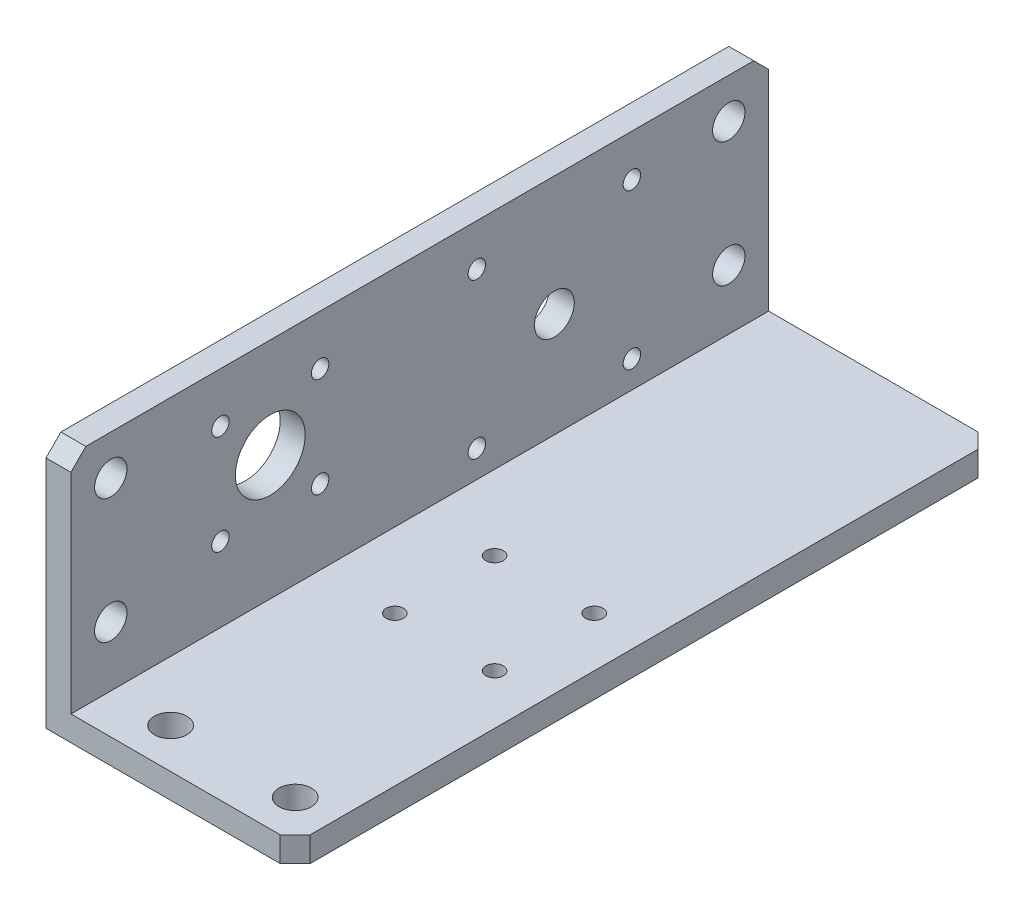
ISO-10303-21;
HEADER;
FILE_DESCRIPTION(('STEP AP214'),'2;1');
FILE_NAME('part.step','',(''),(''),'','','');
FILE_SCHEMA(('AUTOMOTIVE_DESIGN { 1 0 10303 214 1 1 1 1 }'));
ENDSEC;
DATA;
#1=APPLICATION_CONTEXT('core data for automotive mechanical design processes');
#2=APPLICATION_PROTOCOL_DEFINITION('international standard','automotive_design',2000,#1);
#3=PRODUCT_CONTEXT('',#1,'mechanical');
#4=PRODUCT('Part','Part','',(#3));
#5=PRODUCT_RELATED_PRODUCT_CATEGORY('part','',(#4));
#6=PRODUCT_DEFINITION_FORMATION('','',#4);
#7=PRODUCT_DEFINITION_CONTEXT('part definition',#1,'design');
#8=PRODUCT_DEFINITION('design','',#6,#7);
#9=PRODUCT_DEFINITION_SHAPE('','',#8);
#10=(LENGTH_UNIT() NAMED_UNIT(*) SI_UNIT(.MILLI.,.METRE.));
#11=(NAMED_UNIT(*) PLANE_ANGLE_UNIT() SI_UNIT($,.RADIAN.));
#12=(NAMED_UNIT(*) SI_UNIT($,.STERADIAN.) SOLID_ANGLE_UNIT());
#13=UNCERTAINTY_MEASURE_WITH_UNIT(LENGTH_MEASURE(1.E-05),#10,'distance_accuracy_value','');
#14=(GEOMETRIC_REPRESENTATION_CONTEXT(3) GLOBAL_UNCERTAINTY_ASSIGNED_CONTEXT((#13)) GLOBAL_UNIT_ASSIGNED_CONTEXT((#10,
#11,#12)) REPRESENTATION_CONTEXT('',''));
#15=CARTESIAN_POINT('',(0.,0.,0.));
#16=DIRECTION('',(0.,0.,1.));
#17=DIRECTION('',(1.,0.,0.));
#18=AXIS2_PLACEMENT_3D('',#15,#16,#17);
#19=CARTESIAN_POINT('',(50.,0.,140.));
#20=DIRECTION('',(0.,1.,0.));
#21=DIRECTION('',(-1.,0.,0.));
#22=AXIS2_PLACEMENT_3D('',#19,#20,#21);
#23=PLANE('',#22);
#24=CARTESIAN_POINT('',(40.,0.,70.));
#25=DIRECTION('',(0.,-1.,0.));
#26=DIRECTION('',(1.,0.,0.));
#27=AXIS2_PLACEMENT_3D('',#24,#25,#26);
#28=CIRCLE('',#27,1.75000000000001);
#29=CARTESIAN_POINT('',(41.75,0.,70.));
#30=VERTEX_POINT('',#29);
#31=EDGE_CURVE('E276',#30,#30,#28,.T.);
#32=ORIENTED_EDGE('',*,*,#31,.F.);
#33=EDGE_LOOP('',(#32));
#34=FACE_BOUND('',#33,.T.);
#35=CARTESIAN_POINT('',(40.,0.,90.));
#36=DIRECTION('',(0.,-1.,0.));
#37=DIRECTION('',(1.,0.,0.));
#38=AXIS2_PLACEMENT_3D('',#35,#36,#37);
#39=CIRCLE('',#38,1.75000000000001);
#40=CARTESIAN_POINT('',(41.75,0.,90.));
#41=VERTEX_POINT('',#40);
#42=EDGE_CURVE('E270',#41,#41,#39,.T.);
#43=ORIENTED_EDGE('',*,*,#42,.F.);
#44=EDGE_LOOP('',(#43));
#45=FACE_BOUND('',#44,.T.);
#46=CARTESIAN_POINT('',(20.,0.,90.));
#47=DIRECTION('',(0.,-1.,0.));
#48=DIRECTION('',(1.,0.,0.));
#49=AXIS2_PLACEMENT_3D('',#46,#47,#48);
#50=CIRCLE('',#49,1.75000000000001);
#51=CARTESIAN_POINT('',(21.75,0.,90.));
#52=VERTEX_POINT('',#51);
#53=EDGE_CURVE('E264',#52,#52,#50,.T.);
#54=ORIENTED_EDGE('',*,*,#53,.F.);
#55=EDGE_LOOP('',(#54));
#56=FACE_BOUND('',#55,.T.);
#57=CARTESIAN_POINT('',(20.,0.,70.));
#58=DIRECTION('',(0.,-1.,0.));
#59=DIRECTION('',(1.,0.,0.));
#60=AXIS2_PLACEMENT_3D('',#57,#58,#59);
#61=CIRCLE('',#60,1.75);
#62=CARTESIAN_POINT('',(21.75,0.,70.));
#63=VERTEX_POINT('',#62);
#64=EDGE_CURVE('E258',#63,#63,#61,.T.);
#65=ORIENTED_EDGE('',*,*,#64,.F.);
#66=EDGE_LOOP('',(#65));
#67=FACE_BOUND('',#66,.T.);
#68=CARTESIAN_POINT('',(17.,0.,132.));
#69=DIRECTION('',(0.,-1.,0.));
#70=DIRECTION('',(0.,0.,-1.));
#71=AXIS2_PLACEMENT_3D('',#68,#69,#70);
#72=CIRCLE('',#71,3.24999999999999);
#73=CARTESIAN_POINT('',(17.,0.,128.75));
#74=VERTEX_POINT('',#73);
#75=EDGE_CURVE('E228',#74,#74,#72,.T.);
#76=ORIENTED_EDGE('',*,*,#75,.F.);
#77=EDGE_LOOP('',(#76));
#78=FACE_BOUND('',#77,.T.);
#79=CARTESIAN_POINT('',(42.,0.,132.));
#80=DIRECTION('',(0.,-1.,0.));
#81=DIRECTION('',(0.,0.,-1.));
#82=AXIS2_PLACEMENT_3D('',#79,#80,#81);
#83=CIRCLE('',#82,3.24999999999999);
#84=CARTESIAN_POINT('',(42.,0.,128.75));
#85=VERTEX_POINT('',#84);
#86=EDGE_CURVE('E222',#85,#85,#83,.T.);
#87=ORIENTED_EDGE('',*,*,#86,.F.);
#88=EDGE_LOOP('',(#87));
#89=FACE_BOUND('',#88,.T.);
#90=DIRECTION('',(1.,0.,0.));
#91=VECTOR('',#90,1.);
#92=CARTESIAN_POINT('',(50.,0.,0.));
#93=LINE('',#92,#91);
#94=CARTESIAN_POINT('',(0.,0.,0.));
#95=VERTEX_POINT('',#94);
#96=CARTESIAN_POINT('',(47.,0.,0.));
#97=VERTEX_POINT('',#96);
#98=EDGE_CURVE('E142',#95,#97,#93,.T.);
#99=ORIENTED_EDGE('',*,*,#98,.T.);
#100=DIRECTION('',(0.707106781186552,0.,0.707106781186543));
#101=VECTOR('',#100,1.);
#102=CARTESIAN_POINT('',(50.,0.,3.));
#103=LINE('',#102,#101);
#104=CARTESIAN_POINT('',(50.,0.,3.00000000000004));
#105=VERTEX_POINT('',#104);
#106=EDGE_CURVE('E177',#97,#105,#103,.T.);
#107=ORIENTED_EDGE('',*,*,#106,.T.);
#108=DIRECTION('',(0.,0.,-1.));
#109=VECTOR('',#108,1.);
#110=CARTESIAN_POINT('',(50.,0.,140.));
#111=LINE('',#110,#109);
#112=CARTESIAN_POINT('',(50.,0.,137.));
#113=VERTEX_POINT('',#112);
#114=EDGE_CURVE('E159',#113,#105,#111,.T.);
#115=ORIENTED_EDGE('',*,*,#114,.F.);
#116=DIRECTION('',(0.707106781186548,0.,-0.707106781186548));
#117=VECTOR('',#116,1.);
#118=CARTESIAN_POINT('',(47.,0.,140.));
#119=LINE('',#118,#117);
#120=CARTESIAN_POINT('',(47.,0.,140.));
#121=VERTEX_POINT('',#120);
#122=EDGE_CURVE('E175',#113,#121,#119,.F.);
#123=ORIENTED_EDGE('',*,*,#122,.T.);
#124=DIRECTION('',(1.,0.,0.));
#125=VECTOR('',#124,1.);
#126=CARTESIAN_POINT('',(50.,0.,140.));
#127=LINE('',#126,#125);
#128=CARTESIAN_POINT('',(0.,0.,140.));
#129=VERTEX_POINT('',#128);
#130=EDGE_CURVE('E122',#129,#121,#127,.T.);
#131=ORIENTED_EDGE('',*,*,#130,.F.);
#132=DIRECTION('',(0.,0.,-1.));
#133=VECTOR('',#132,1.);
#134=CARTESIAN_POINT('',(0.,0.,140.));
#135=LINE('',#134,#133);
#136=EDGE_CURVE('E138',#129,#95,#135,.T.);
#137=ORIENTED_EDGE('',*,*,#136,.T.);
#138=EDGE_LOOP('',(#99,#107,#115,#123,#131,#137));
#139=FACE_BOUND('',#138,.T.);
#140=ADVANCED_FACE('F36',(#34,#45,#56,#67,#78,#89,#139),#23,.F.);
#141=CARTESIAN_POINT('',(50.,5.,140.));
#142=DIRECTION('',(-1.,0.,0.));
#143=DIRECTION('',(0.,0.,1.));
#144=AXIS2_PLACEMENT_3D('',#141,#142,#143);
#145=PLANE('',#144);
#146=ORIENTED_EDGE('',*,*,#114,.T.);
#147=DIRECTION('',(0.,1.,0.));
#148=VECTOR('',#147,1.);
#149=CARTESIAN_POINT('',(50.,5.,3.));
#150=LINE('',#149,#148);
#151=CARTESIAN_POINT('',(50.,5.,3.00000000000004));
#152=VERTEX_POINT('',#151);
#153=EDGE_CURVE('E164',#105,#152,#150,.T.);
#154=ORIENTED_EDGE('',*,*,#153,.T.);
#155=DIRECTION('',(0.,0.,-1.));
#156=VECTOR('',#155,1.);
#157=CARTESIAN_POINT('',(50.,5.,140.));
#158=LINE('',#157,#156);
#159=CARTESIAN_POINT('',(50.,5.,137.));
#160=VERTEX_POINT('',#159);
#161=EDGE_CURVE('E132',#160,#152,#158,.T.);
#162=ORIENTED_EDGE('',*,*,#161,.F.);
#163=DIRECTION('',(0.,-1.,0.));
#164=VECTOR('',#163,1.);
#165=CARTESIAN_POINT('',(50.,5.,137.));
#166=LINE('',#165,#164);
#167=EDGE_CURVE('E162',#160,#113,#166,.T.);
#168=ORIENTED_EDGE('',*,*,#167,.T.);
#169=EDGE_LOOP('',(#146,#154,#162,#168));
#170=FACE_BOUND('',#169,.T.);
#171=ADVANCED_FACE('F214',(#170),#145,.F.);
#172=CARTESIAN_POINT('',(5.00000000000001,5.,140.));
#173=DIRECTION('',(0.,-1.,0.));
#174=DIRECTION('',(1.,0.,0.));
#175=AXIS2_PLACEMENT_3D('',#172,#173,#174);
#176=PLANE('',#175);
#177=CARTESIAN_POINT('',(40.,5.,70.));
#178=DIRECTION('',(0.,-1.,0.));
#179=DIRECTION('',(1.,0.,0.));
#180=AXIS2_PLACEMENT_3D('',#177,#178,#179);
#181=CIRCLE('',#180,1.75000000000001);
#182=CARTESIAN_POINT('',(41.75,5.,70.));
#183=VERTEX_POINT('',#182);
#184=EDGE_CURVE('E273',#183,#183,#181,.F.);
#185=ORIENTED_EDGE('',*,*,#184,.F.);
#186=EDGE_LOOP('',(#185));
#187=FACE_BOUND('',#186,.T.);
#188=CARTESIAN_POINT('',(40.,5.,90.));
#189=DIRECTION('',(0.,-1.,0.));
#190=DIRECTION('',(1.,0.,0.));
#191=AXIS2_PLACEMENT_3D('',#188,#189,#190);
#192=CIRCLE('',#191,1.75000000000001);
#193=CARTESIAN_POINT('',(41.75,5.,90.));
#194=VERTEX_POINT('',#193);
#195=EDGE_CURVE('E267',#194,#194,#192,.F.);
#196=ORIENTED_EDGE('',*,*,#195,.F.);
#197=EDGE_LOOP('',(#196));
#198=FACE_BOUND('',#197,.T.);
#199=CARTESIAN_POINT('',(20.,5.,90.));
#200=DIRECTION('',(0.,-1.,0.));
#201=DIRECTION('',(1.,0.,0.));
#202=AXIS2_PLACEMENT_3D('',#199,#200,#201);
#203=CIRCLE('',#202,1.75000000000001);
#204=CARTESIAN_POINT('',(21.75,5.,90.));
#205=VERTEX_POINT('',#204);
#206=EDGE_CURVE('E261',#205,#205,#203,.F.);
#207=ORIENTED_EDGE('',*,*,#206,.F.);
#208=EDGE_LOOP('',(#207));
#209=FACE_BOUND('',#208,.T.);
#210=CARTESIAN_POINT('',(20.,5.,70.));
#211=DIRECTION('',(0.,-1.,0.));
#212=DIRECTION('',(1.,0.,0.));
#213=AXIS2_PLACEMENT_3D('',#210,#211,#212);
#214=CIRCLE('',#213,1.75);
#215=CARTESIAN_POINT('',(21.75,5.,70.));
#216=VERTEX_POINT('',#215);
#217=EDGE_CURVE('E255',#216,#216,#214,.F.);
#218=ORIENTED_EDGE('',*,*,#217,.F.);
#219=EDGE_LOOP('',(#218));
#220=FACE_BOUND('',#219,.T.);
#221=CARTESIAN_POINT('',(17.,5.,132.));
#222=DIRECTION('',(0.,-1.,0.));
#223=DIRECTION('',(1.,0.,0.));
#224=AXIS2_PLACEMENT_3D('',#221,#222,#223);
#225=CIRCLE('',#224,3.24999999999999);
#226=CARTESIAN_POINT('',(20.25,5.,132.));
#227=VERTEX_POINT('',#226);
#228=EDGE_CURVE('E225',#227,#227,#225,.T.);
#229=ORIENTED_EDGE('',*,*,#228,.T.);
#230=EDGE_LOOP('',(#229));
#231=FACE_BOUND('',#230,.T.);
#232=CARTESIAN_POINT('',(42.,5.,132.));
#233=DIRECTION('',(0.,-1.,0.));
#234=DIRECTION('',(1.,0.,0.));
#235=AXIS2_PLACEMENT_3D('',#232,#233,#234);
#236=CIRCLE('',#235,3.24999999999999);
#237=CARTESIAN_POINT('',(45.25,5.,132.));
#238=VERTEX_POINT('',#237);
#239=EDGE_CURVE('E145',#238,#238,#236,.T.);
#240=ORIENTED_EDGE('',*,*,#239,.T.);
#241=EDGE_LOOP('',(#240));
#242=FACE_BOUND('',#241,.T.);
#243=ORIENTED_EDGE('',*,*,#161,.T.);
#244=DIRECTION('',(-0.707106781186552,0.,-0.707106781186543));
#245=VECTOR('',#244,1.);
#246=CARTESIAN_POINT('',(50.,5.,3.));
#247=LINE('',#246,#245);
#248=CARTESIAN_POINT('',(46.9999999999999,5.,0.));
#249=VERTEX_POINT('',#248);
#250=EDGE_CURVE('E169',#152,#249,#247,.T.);
#251=ORIENTED_EDGE('',*,*,#250,.T.);
#252=DIRECTION('',(-1.,0.,0.));
#253=VECTOR('',#252,1.);
#254=CARTESIAN_POINT('',(5.00000000000001,5.,0.));
#255=LINE('',#254,#253);
#256=CARTESIAN_POINT('',(5.00000000000001,5.,0.));
#257=VERTEX_POINT('',#256);
#258=EDGE_CURVE('E129',#249,#257,#255,.T.);
#259=ORIENTED_EDGE('',*,*,#258,.T.);
#260=DIRECTION('',(0.,0.,-1.));
#261=VECTOR('',#260,1.);
#262=CARTESIAN_POINT('',(5.00000000000001,5.,140.));
#263=LINE('',#262,#261);
#264=CARTESIAN_POINT('',(5.00000000000001,5.,140.));
#265=VERTEX_POINT('',#264);
#266=EDGE_CURVE('E125',#265,#257,#263,.T.);
#267=ORIENTED_EDGE('',*,*,#266,.F.);
#268=DIRECTION('',(-1.,0.,0.));
#269=VECTOR('',#268,1.);
#270=CARTESIAN_POINT('',(5.00000000000001,5.,140.));
#271=LINE('',#270,#269);
#272=CARTESIAN_POINT('',(47.,5.,140.));
#273=VERTEX_POINT('',#272);
#274=EDGE_CURVE('E115',#273,#265,#271,.T.);
#275=ORIENTED_EDGE('',*,*,#274,.F.);
#276=DIRECTION('',(-0.707106781186548,0.,0.707106781186548));
#277=VECTOR('',#276,1.);
#278=CARTESIAN_POINT('',(47.,5.,140.));
#279=LINE('',#278,#277);
#280=EDGE_CURVE('E167',#273,#160,#279,.F.);
#281=ORIENTED_EDGE('',*,*,#280,.T.);
#282=EDGE_LOOP('',(#243,#251,#259,#267,#275,#281));
#283=FACE_BOUND('',#282,.T.);
#284=ADVANCED_FACE('F127',(#187,#198,#209,#220,#231,#242,#283),#176,.F.);
#285=CARTESIAN_POINT('',(5.,50.,140.));
#286=DIRECTION('',(-1.,0.,0.));
#287=DIRECTION('',(0.,-1.,0.));
#288=AXIS2_PLACEMENT_3D('',#285,#286,#287);
#289=PLANE('',#288);
#290=CARTESIAN_POINT('',(5.,41.556349186104,27.4436508138959));
#291=DIRECTION('',(-1.,0.,0.));
#292=DIRECTION('',(0.,-1.,0.));
#293=AXIS2_PLACEMENT_3D('',#290,#291,#292);
#294=CIRCLE('',#293,1.75000000000001);
#295=CARTESIAN_POINT('',(5.,39.806349186104,27.4436508138959));
#296=VERTEX_POINT('',#295);
#297=EDGE_CURVE('E333',#296,#296,#294,.F.);
#298=ORIENTED_EDGE('',*,*,#297,.F.);
#299=EDGE_LOOP('',(#298));
#300=FACE_BOUND('',#299,.T.);
#301=CARTESIAN_POINT('',(5.,10.4436508138959,27.443650813896));
#302=DIRECTION('',(-1.,0.,0.));
#303=DIRECTION('',(0.,-1.,0.));
#304=AXIS2_PLACEMENT_3D('',#301,#302,#303);
#305=CIRCLE('',#304,1.75);
#306=CARTESIAN_POINT('',(5.,8.69365081389594,27.443650813896));
#307=VERTEX_POINT('',#306);
#308=EDGE_CURVE('E327',#307,#307,#305,.F.);
#309=ORIENTED_EDGE('',*,*,#308,.F.);
#310=EDGE_LOOP('',(#309));
#311=FACE_BOUND('',#310,.T.);
#312=CARTESIAN_POINT('',(5.,10.443650813896,58.5563491861041));
#313=DIRECTION('',(-1.,0.,0.));
#314=DIRECTION('',(0.,-1.,0.));
#315=AXIS2_PLACEMENT_3D('',#312,#313,#314);
#316=CIRCLE('',#315,1.75000000000001);
#317=CARTESIAN_POINT('',(5.,8.69365081389597,58.5563491861041));
#318=VERTEX_POINT('',#317);
#319=EDGE_CURVE('E321',#318,#318,#316,.F.);
#320=ORIENTED_EDGE('',*,*,#319,.F.);
#321=EDGE_LOOP('',(#320));
#322=FACE_BOUND('',#321,.T.);
#323=CARTESIAN_POINT('',(5.,41.5563491861041,58.556349186104));
#324=DIRECTION('',(-1.,0.,0.));
#325=DIRECTION('',(0.,-1.,0.));
#326=AXIS2_PLACEMENT_3D('',#323,#324,#325);
#327=CIRCLE('',#326,1.75);
#328=CARTESIAN_POINT('',(5.,39.8063491861041,58.556349186104));
#329=VERTEX_POINT('',#328);
#330=EDGE_CURVE('E315',#329,#329,#327,.F.);
#331=ORIENTED_EDGE('',*,*,#330,.F.);
#332=EDGE_LOOP('',(#331));
#333=FACE_BOUND('',#332,.T.);
#334=CARTESIAN_POINT('',(5.,26.,43.));
#335=DIRECTION('',(-1.,0.,0.));
#336=DIRECTION('',(0.,-1.,0.));
#337=AXIS2_PLACEMENT_3D('',#334,#335,#336);
#338=CIRCLE('',#337,4.00000000000001);
#339=CARTESIAN_POINT('',(5.00000000000001,22.,43.));
#340=VERTEX_POINT('',#339);
#341=EDGE_CURVE('E309',#340,#340,#338,.F.);
#342=ORIENTED_EDGE('',*,*,#341,.F.);
#343=EDGE_LOOP('',(#342));
#344=FACE_BOUND('',#343,.T.);
#345=CARTESIAN_POINT('',(5.,20.,90.));
#346=DIRECTION('',(-1.,0.,0.));
#347=DIRECTION('',(0.,-1.,0.));
#348=AXIS2_PLACEMENT_3D('',#345,#346,#347);
#349=CIRCLE('',#348,1.75000000000001);
#350=CARTESIAN_POINT('',(5.,18.25,90.));
#351=VERTEX_POINT('',#350);
#352=EDGE_CURVE('E303',#351,#351,#349,.F.);
#353=ORIENTED_EDGE('',*,*,#352,.F.);
#354=EDGE_LOOP('',(#353));
#355=FACE_BOUND('',#354,.T.);
#356=CARTESIAN_POINT('',(5.,20.,110.));
#357=DIRECTION('',(-1.,0.,0.));
#358=DIRECTION('',(0.,-1.,0.));
#359=AXIS2_PLACEMENT_3D('',#356,#357,#358);
#360=CIRCLE('',#359,1.75);
#361=CARTESIAN_POINT('',(5.,18.25,110.));
#362=VERTEX_POINT('',#361);
#363=EDGE_CURVE('E297',#362,#362,#360,.F.);
#364=ORIENTED_EDGE('',*,*,#363,.F.);
#365=EDGE_LOOP('',(#364));
#366=FACE_BOUND('',#365,.T.);
#367=CARTESIAN_POINT('',(5.,40.,110.));
#368=DIRECTION('',(-1.,0.,0.));
#369=DIRECTION('',(0.,-1.,0.));
#370=AXIS2_PLACEMENT_3D('',#367,#368,#369);
#371=CIRCLE('',#370,1.75000000000001);
#372=CARTESIAN_POINT('',(5.,38.25,110.));
#373=VERTEX_POINT('',#372);
#374=EDGE_CURVE('E291',#373,#373,#371,.F.);
#375=ORIENTED_EDGE('',*,*,#374,.F.);
#376=EDGE_LOOP('',(#375));
#377=FACE_BOUND('',#376,.T.);
#378=CARTESIAN_POINT('',(5.,30.,100.));
#379=DIRECTION('',(-1.,0.,0.));
#380=DIRECTION('',(0.,-1.,0.));
#381=AXIS2_PLACEMENT_3D('',#378,#379,#380);
#382=CIRCLE('',#381,7.);
#383=CARTESIAN_POINT('',(5.00000000000001,23.,100.));
#384=VERTEX_POINT('',#383);
#385=EDGE_CURVE('E285',#384,#384,#382,.F.);
#386=ORIENTED_EDGE('',*,*,#385,.F.);
#387=EDGE_LOOP('',(#386));
#388=FACE_BOUND('',#387,.T.);
#389=CARTESIAN_POINT('',(5.,40.,90.));
#390=DIRECTION('',(-1.,0.,0.));
#391=DIRECTION('',(0.,-1.,0.));
#392=AXIS2_PLACEMENT_3D('',#389,#390,#391);
#393=CIRCLE('',#392,1.75);
#394=CARTESIAN_POINT('',(5.,38.25,90.));
#395=VERTEX_POINT('',#394);
#396=EDGE_CURVE('E279',#395,#395,#393,.F.);
#397=ORIENTED_EDGE('',*,*,#396,.F.);
#398=EDGE_LOOP('',(#397));
#399=FACE_BOUND('',#398,.T.);
#400=CARTESIAN_POINT('',(5.,42.,8.00000000000001));
#401=DIRECTION('',(-1.,0.,0.));
#402=DIRECTION('',(0.,0.,1.));
#403=AXIS2_PLACEMENT_3D('',#400,#401,#402);
#404=CIRCLE('',#403,3.25);
#405=CARTESIAN_POINT('',(5.,42.,11.25));
#406=VERTEX_POINT('',#405);
#407=EDGE_CURVE('E249',#406,#406,#404,.T.);
#408=ORIENTED_EDGE('',*,*,#407,.T.);
#409=EDGE_LOOP('',(#408));
#410=FACE_BOUND('',#409,.T.);
#411=CARTESIAN_POINT('',(5.,17.,8.00000000000001));
#412=DIRECTION('',(-1.,0.,0.));
#413=DIRECTION('',(0.,0.,1.));
#414=AXIS2_PLACEMENT_3D('',#411,#412,#413);
#415=CIRCLE('',#414,3.25);
#416=CARTESIAN_POINT('',(5.,17.,11.25));
#417=VERTEX_POINT('',#416);
#418=EDGE_CURVE('E243',#417,#417,#415,.T.);
#419=ORIENTED_EDGE('',*,*,#418,.T.);
#420=EDGE_LOOP('',(#419));
#421=FACE_BOUND('',#420,.T.);
#422=CARTESIAN_POINT('',(5.,42.,132.));
#423=DIRECTION('',(-1.,0.,0.));
#424=DIRECTION('',(0.,0.,1.));
#425=AXIS2_PLACEMENT_3D('',#422,#423,#424);
#426=CIRCLE('',#425,3.25);
#427=CARTESIAN_POINT('',(5.,42.,135.25));
#428=VERTEX_POINT('',#427);
#429=EDGE_CURVE('E237',#428,#428,#426,.T.);
#430=ORIENTED_EDGE('',*,*,#429,.T.);
#431=EDGE_LOOP('',(#430));
#432=FACE_BOUND('',#431,.T.);
#433=CARTESIAN_POINT('',(5.,17.,132.));
#434=DIRECTION('',(-1.,0.,0.));
#435=DIRECTION('',(0.,0.,1.));
#436=AXIS2_PLACEMENT_3D('',#433,#434,#435);
#437=CIRCLE('',#436,3.25);
#438=CARTESIAN_POINT('',(5.,17.,135.25));
#439=VERTEX_POINT('',#438);
#440=EDGE_CURVE('E231',#439,#439,#437,.T.);
#441=ORIENTED_EDGE('',*,*,#440,.T.);
#442=EDGE_LOOP('',(#441));
#443=FACE_BOUND('',#442,.T.);
#444=DIRECTION('',(0.,1.,0.));
#445=VECTOR('',#444,1.);
#446=CARTESIAN_POINT('',(5.,50.,0.));
#447=LINE('',#446,#445);
#448=CARTESIAN_POINT('',(5.,47.,0.));
#449=VERTEX_POINT('',#448);
#450=EDGE_CURVE('E147',#257,#449,#447,.T.);
#451=ORIENTED_EDGE('',*,*,#450,.T.);
#452=DIRECTION('',(0.,0.707106781186552,0.707106781186543));
#453=VECTOR('',#452,1.);
#454=CARTESIAN_POINT('',(5.,50.,3.));
#455=LINE('',#454,#453);
#456=CARTESIAN_POINT('',(5.,50.,3.00000000000004));
#457=VERTEX_POINT('',#456);
#458=EDGE_CURVE('E188',#449,#457,#455,.T.);
#459=ORIENTED_EDGE('',*,*,#458,.T.);
#460=DIRECTION('',(0.,0.,-1.));
#461=VECTOR('',#460,1.);
#462=CARTESIAN_POINT('',(5.,50.,140.));
#463=LINE('',#462,#461);
#464=CARTESIAN_POINT('',(5.,50.,137.));
#465=VERTEX_POINT('',#464);
#466=EDGE_CURVE('E133',#465,#457,#463,.T.);
#467=ORIENTED_EDGE('',*,*,#466,.F.);
#468=DIRECTION('',(0.,0.707106781186548,-0.707106781186548));
#469=VECTOR('',#468,1.);
#470=CARTESIAN_POINT('',(5.,47.,140.));
#471=LINE('',#470,#469);
#472=CARTESIAN_POINT('',(5.,47.,140.));
#473=VERTEX_POINT('',#472);
#474=EDGE_CURVE('E51',#465,#473,#471,.F.);
#475=ORIENTED_EDGE('',*,*,#474,.T.);
#476=DIRECTION('',(0.,1.,0.));
#477=VECTOR('',#476,1.);
#478=CARTESIAN_POINT('',(5.,50.,140.));
#479=LINE('',#478,#477);
#480=EDGE_CURVE('E118',#265,#473,#479,.T.);
#481=ORIENTED_EDGE('',*,*,#480,.F.);
#482=ORIENTED_EDGE('',*,*,#266,.T.);
#483=EDGE_LOOP('',(#451,#459,#467,#475,#481,#482));
#484=FACE_BOUND('',#483,.T.);
#485=ADVANCED_FACE('F135',(#300,#311,#322,#333,#344,#355,#366,#377,#388,#399,#410,#421,#432,
#443,#484),#289,.F.);
#486=CARTESIAN_POINT('',(0.,50.,140.));
#487=DIRECTION('',(0.,-1.,0.));
#488=DIRECTION('',(0.,0.,-1.));
#489=AXIS2_PLACEMENT_3D('',#486,#487,#488);
#490=PLANE('',#489);
#491=ORIENTED_EDGE('',*,*,#466,.T.);
#492=DIRECTION('',(-1.,0.,0.));
#493=VECTOR('',#492,1.);
#494=CARTESIAN_POINT('',(0.,50.,3.));
#495=LINE('',#494,#493);
#496=CARTESIAN_POINT('',(0.,50.,3.00000000000004));
#497=VERTEX_POINT('',#496);
#498=EDGE_CURVE('E181',#457,#497,#495,.T.);
#499=ORIENTED_EDGE('',*,*,#498,.T.);
#500=DIRECTION('',(0.,0.,-1.));
#501=VECTOR('',#500,1.);
#502=CARTESIAN_POINT('',(0.,50.,140.));
#503=LINE('',#502,#501);
#504=CARTESIAN_POINT('',(0.,50.,137.));
#505=VERTEX_POINT('',#504);
#506=EDGE_CURVE('E153',#505,#497,#503,.T.);
#507=ORIENTED_EDGE('',*,*,#506,.F.);
#508=DIRECTION('',(1.,0.,0.));
#509=VECTOR('',#508,1.);
#510=CARTESIAN_POINT('',(0.,50.,137.));
#511=LINE('',#510,#509);
#512=EDGE_CURVE('E179',#505,#465,#511,.T.);
#513=ORIENTED_EDGE('',*,*,#512,.T.);
#514=EDGE_LOOP('',(#491,#499,#507,#513));
#515=FACE_BOUND('',#514,.T.);
#516=ADVANCED_FACE('F194',(#515),#490,.F.);
#517=CARTESIAN_POINT('',(0.,0.,140.));
#518=DIRECTION('',(1.,0.,0.));
#519=DIRECTION('',(0.,0.,-1.));
#520=AXIS2_PLACEMENT_3D('',#517,#518,#519);
#521=PLANE('',#520);
#522=CARTESIAN_POINT('',(0.,41.556349186104,27.4436508138959));
#523=DIRECTION('',(-1.,0.,0.));
#524=DIRECTION('',(0.,0.,1.));
#525=AXIS2_PLACEMENT_3D('',#522,#523,#524);
#526=CIRCLE('',#525,1.75000000000001);
#527=CARTESIAN_POINT('',(0.,41.556349186104,29.1936508138959));
#528=VERTEX_POINT('',#527);
#529=EDGE_CURVE('E336',#528,#528,#526,.T.);
#530=ORIENTED_EDGE('',*,*,#529,.F.);
#531=EDGE_LOOP('',(#530));
#532=FACE_BOUND('',#531,.T.);
#533=CARTESIAN_POINT('',(0.,10.4436508138959,27.443650813896));
#534=DIRECTION('',(-1.,0.,0.));
#535=DIRECTION('',(0.,0.,1.));
#536=AXIS2_PLACEMENT_3D('',#533,#534,#535);
#537=CIRCLE('',#536,1.75);
#538=CARTESIAN_POINT('',(0.,10.4436508138959,29.193650813896));
#539=VERTEX_POINT('',#538);
#540=EDGE_CURVE('E330',#539,#539,#537,.T.);
#541=ORIENTED_EDGE('',*,*,#540,.F.);
#542=EDGE_LOOP('',(#541));
#543=FACE_BOUND('',#542,.T.);
#544=CARTESIAN_POINT('',(0.,10.443650813896,58.5563491861041));
#545=DIRECTION('',(-1.,0.,0.));
#546=DIRECTION('',(0.,0.,1.));
#547=AXIS2_PLACEMENT_3D('',#544,#545,#546);
#548=CIRCLE('',#547,1.75000000000001);
#549=CARTESIAN_POINT('',(0.,10.443650813896,60.3063491861041));
#550=VERTEX_POINT('',#549);
#551=EDGE_CURVE('E324',#550,#550,#548,.T.);
#552=ORIENTED_EDGE('',*,*,#551,.F.);
#553=EDGE_LOOP('',(#552));
#554=FACE_BOUND('',#553,.T.);
#555=CARTESIAN_POINT('',(0.,41.5563491861041,58.556349186104));
#556=DIRECTION('',(-1.,0.,0.));
#557=DIRECTION('',(0.,0.,1.));
#558=AXIS2_PLACEMENT_3D('',#555,#556,#557);
#559=CIRCLE('',#558,1.75);
#560=CARTESIAN_POINT('',(0.,41.5563491861041,60.306349186104));
#561=VERTEX_POINT('',#560);
#562=EDGE_CURVE('E318',#561,#561,#559,.T.);
#563=ORIENTED_EDGE('',*,*,#562,.F.);
#564=EDGE_LOOP('',(#563));
#565=FACE_BOUND('',#564,.T.);
#566=CARTESIAN_POINT('',(0.,26.,43.));
#567=DIRECTION('',(-1.,0.,0.));
#568=DIRECTION('',(0.,0.,1.));
#569=AXIS2_PLACEMENT_3D('',#566,#567,#568);
#570=CIRCLE('',#569,4.00000000000001);
#571=CARTESIAN_POINT('',(0.,26.,47.));
#572=VERTEX_POINT('',#571);
#573=EDGE_CURVE('E312',#572,#572,#570,.T.);
#574=ORIENTED_EDGE('',*,*,#573,.F.);
#575=EDGE_LOOP('',(#574));
#576=FACE_BOUND('',#575,.T.);
#577=CARTESIAN_POINT('',(0.,20.,90.));
#578=DIRECTION('',(-1.,0.,0.));
#579=DIRECTION('',(0.,0.,1.));
#580=AXIS2_PLACEMENT_3D('',#577,#578,#579);
#581=CIRCLE('',#580,1.75000000000001);
#582=CARTESIAN_POINT('',(0.,20.,91.75));
#583=VERTEX_POINT('',#582);
#584=EDGE_CURVE('E306',#583,#583,#581,.T.);
#585=ORIENTED_EDGE('',*,*,#584,.F.);
#586=EDGE_LOOP('',(#585));
#587=FACE_BOUND('',#586,.T.);
#588=CARTESIAN_POINT('',(0.,20.,110.));
#589=DIRECTION('',(-1.,0.,0.));
#590=DIRECTION('',(0.,0.,1.));
#591=AXIS2_PLACEMENT_3D('',#588,#589,#590);
#592=CIRCLE('',#591,1.75);
#593=CARTESIAN_POINT('',(0.,20.,111.75));
#594=VERTEX_POINT('',#593);
#595=EDGE_CURVE('E300',#594,#594,#592,.T.);
#596=ORIENTED_EDGE('',*,*,#595,.F.);
#597=EDGE_LOOP('',(#596));
#598=FACE_BOUND('',#597,.T.);
#599=CARTESIAN_POINT('',(0.,40.,110.));
#600=DIRECTION('',(-1.,0.,0.));
#601=DIRECTION('',(0.,0.,1.));
#602=AXIS2_PLACEMENT_3D('',#599,#600,#601);
#603=CIRCLE('',#602,1.75000000000001);
#604=CARTESIAN_POINT('',(0.,40.,111.75));
#605=VERTEX_POINT('',#604);
#606=EDGE_CURVE('E294',#605,#605,#603,.T.);
#607=ORIENTED_EDGE('',*,*,#606,.F.);
#608=EDGE_LOOP('',(#607));
#609=FACE_BOUND('',#608,.T.);
#610=CARTESIAN_POINT('',(0.,30.,100.));
#611=DIRECTION('',(-1.,0.,0.));
#612=DIRECTION('',(0.,0.,1.));
#613=AXIS2_PLACEMENT_3D('',#610,#611,#612);
#614=CIRCLE('',#613,7.);
#615=CARTESIAN_POINT('',(0.,30.,107.));
#616=VERTEX_POINT('',#615);
#617=EDGE_CURVE('E288',#616,#616,#614,.T.);
#618=ORIENTED_EDGE('',*,*,#617,.F.);
#619=EDGE_LOOP('',(#618));
#620=FACE_BOUND('',#619,.T.);
#621=CARTESIAN_POINT('',(0.,40.,90.));
#622=DIRECTION('',(-1.,0.,0.));
#623=DIRECTION('',(0.,0.,1.));
#624=AXIS2_PLACEMENT_3D('',#621,#622,#623);
#625=CIRCLE('',#624,1.75);
#626=CARTESIAN_POINT('',(0.,40.,91.75));
#627=VERTEX_POINT('',#626);
#628=EDGE_CURVE('E282',#627,#627,#625,.T.);
#629=ORIENTED_EDGE('',*,*,#628,.F.);
#630=EDGE_LOOP('',(#629));
#631=FACE_BOUND('',#630,.T.);
#632=CARTESIAN_POINT('',(0.,42.,8.00000000000001));
#633=DIRECTION('',(-1.,0.,0.));
#634=DIRECTION('',(0.,0.,1.));
#635=AXIS2_PLACEMENT_3D('',#632,#633,#634);
#636=CIRCLE('',#635,3.24999999999999);
#637=CARTESIAN_POINT('',(0.,42.,11.25));
#638=VERTEX_POINT('',#637);
#639=EDGE_CURVE('E252',#638,#638,#636,.T.);
#640=ORIENTED_EDGE('',*,*,#639,.F.);
#641=EDGE_LOOP('',(#640));
#642=FACE_BOUND('',#641,.T.);
#643=CARTESIAN_POINT('',(0.,17.,8.00000000000001));
#644=DIRECTION('',(-1.,0.,0.));
#645=DIRECTION('',(0.,0.,1.));
#646=AXIS2_PLACEMENT_3D('',#643,#644,#645);
#647=CIRCLE('',#646,3.24999999999999);
#648=CARTESIAN_POINT('',(0.,17.,11.25));
#649=VERTEX_POINT('',#648);
#650=EDGE_CURVE('E246',#649,#649,#647,.T.);
#651=ORIENTED_EDGE('',*,*,#650,.F.);
#652=EDGE_LOOP('',(#651));
#653=FACE_BOUND('',#652,.T.);
#654=CARTESIAN_POINT('',(0.,42.,132.));
#655=DIRECTION('',(-1.,0.,0.));
#656=DIRECTION('',(0.,0.,1.));
#657=AXIS2_PLACEMENT_3D('',#654,#655,#656);
#658=CIRCLE('',#657,3.24999999999999);
#659=CARTESIAN_POINT('',(0.,42.,135.25));
#660=VERTEX_POINT('',#659);
#661=EDGE_CURVE('E240',#660,#660,#658,.T.);
#662=ORIENTED_EDGE('',*,*,#661,.F.);
#663=EDGE_LOOP('',(#662));
#664=FACE_BOUND('',#663,.T.);
#665=CARTESIAN_POINT('',(0.,17.,132.));
#666=DIRECTION('',(-1.,0.,0.));
#667=DIRECTION('',(0.,0.,1.));
#668=AXIS2_PLACEMENT_3D('',#665,#666,#667);
#669=CIRCLE('',#668,3.24999999999999);
#670=CARTESIAN_POINT('',(0.,17.,135.25));
#671=VERTEX_POINT('',#670);
#672=EDGE_CURVE('E234',#671,#671,#669,.T.);
#673=ORIENTED_EDGE('',*,*,#672,.F.);
#674=EDGE_LOOP('',(#673));
#675=FACE_BOUND('',#674,.T.);
#676=ORIENTED_EDGE('',*,*,#506,.T.);
#677=DIRECTION('',(0.,-0.707106781186552,-0.707106781186543));
#678=VECTOR('',#677,1.);
#679=CARTESIAN_POINT('',(0.,50.,3.));
#680=LINE('',#679,#678);
#681=CARTESIAN_POINT('',(0.,47.,0.));
#682=VERTEX_POINT('',#681);
#683=EDGE_CURVE('E185',#497,#682,#680,.T.);
#684=ORIENTED_EDGE('',*,*,#683,.T.);
#685=DIRECTION('',(0.,-1.,0.));
#686=VECTOR('',#685,1.);
#687=CARTESIAN_POINT('',(0.,0.,0.));
#688=LINE('',#687,#686);
#689=EDGE_CURVE('E149',#682,#95,#688,.T.);
#690=ORIENTED_EDGE('',*,*,#689,.T.);
#691=ORIENTED_EDGE('',*,*,#136,.F.);
#692=DIRECTION('',(0.,-1.,0.));
#693=VECTOR('',#692,1.);
#694=CARTESIAN_POINT('',(0.,0.,140.));
#695=LINE('',#694,#693);
#696=CARTESIAN_POINT('',(0.,47.,140.));
#697=VERTEX_POINT('',#696);
#698=EDGE_CURVE('E136',#697,#129,#695,.T.);
#699=ORIENTED_EDGE('',*,*,#698,.F.);
#700=DIRECTION('',(0.,-0.707106781186548,0.707106781186548));
#701=VECTOR('',#700,1.);
#702=CARTESIAN_POINT('',(0.,47.,140.));
#703=LINE('',#702,#701);
#704=EDGE_CURVE('E59',#697,#505,#703,.F.);
#705=ORIENTED_EDGE('',*,*,#704,.T.);
#706=EDGE_LOOP('',(#676,#684,#690,#691,#699,#705));
#707=FACE_BOUND('',#706,.T.);
#708=ADVANCED_FACE('F199',(#532,#543,#554,#565,#576,#587,#598,#609,#620,#631,#642,#653,#664,
#675,#707),#521,.F.);
#709=CARTESIAN_POINT('',(0.,0.,140.));
#710=DIRECTION('',(0.,0.,-1.));
#711=DIRECTION('',(-1.,0.,0.));
#712=AXIS2_PLACEMENT_3D('',#709,#710,#711);
#713=PLANE('',#712);
#714=ORIENTED_EDGE('',*,*,#480,.T.);
#715=DIRECTION('',(-1.,0.,0.));
#716=VECTOR('',#715,1.);
#717=CARTESIAN_POINT('',(0.,47.,140.));
#718=LINE('',#717,#716);
#719=EDGE_CURVE('E11',#473,#697,#718,.T.);
#720=ORIENTED_EDGE('',*,*,#719,.T.);
#721=ORIENTED_EDGE('',*,*,#698,.T.);
#722=ORIENTED_EDGE('',*,*,#130,.T.);
#723=DIRECTION('',(0.,1.,0.));
#724=VECTOR('',#723,1.);
#725=CARTESIAN_POINT('',(47.,0.,140.));
#726=LINE('',#725,#724);
#727=EDGE_CURVE('E44',#121,#273,#726,.T.);
#728=ORIENTED_EDGE('',*,*,#727,.T.);
#729=ORIENTED_EDGE('',*,*,#274,.T.);
#730=EDGE_LOOP('',(#714,#720,#721,#722,#728,#729));
#731=FACE_BOUND('',#730,.T.);
#732=ADVANCED_FACE('F117',(#731),#713,.F.);
#733=CARTESIAN_POINT('',(0.,0.,0.));
#734=DIRECTION('',(0.,0.,-1.));
#735=DIRECTION('',(-1.,0.,0.));
#736=AXIS2_PLACEMENT_3D('',#733,#734,#735);
#737=PLANE('',#736);
#738=ORIENTED_EDGE('',*,*,#258,.F.);
#739=DIRECTION('',(0.,-1.,0.));
#740=VECTOR('',#739,1.);
#741=CARTESIAN_POINT('',(47.,0.,0.));
#742=LINE('',#741,#740);
#743=EDGE_CURVE('E173',#249,#97,#742,.T.);
#744=ORIENTED_EDGE('',*,*,#743,.T.);
#745=ORIENTED_EDGE('',*,*,#98,.F.);
#746=ORIENTED_EDGE('',*,*,#689,.F.);
#747=DIRECTION('',(1.,0.,0.));
#748=VECTOR('',#747,1.);
#749=CARTESIAN_POINT('',(5.,47.,0.));
#750=LINE('',#749,#748);
#751=EDGE_CURVE('E171',#682,#449,#750,.T.);
#752=ORIENTED_EDGE('',*,*,#751,.T.);
#753=ORIENTED_EDGE('',*,*,#450,.F.);
#754=EDGE_LOOP('',(#738,#744,#745,#746,#752,#753));
#755=FACE_BOUND('',#754,.T.);
#756=ADVANCED_FACE('F203',(#755),#737,.T.);
#757=CARTESIAN_POINT('',(42.,0.,132.));
#758=DIRECTION('',(0.,-1.,0.));
#759=DIRECTION('',(0.,0.,-1.));
#760=AXIS2_PLACEMENT_3D('',#757,#758,#759);
#761=CYLINDRICAL_SURFACE('',#760,3.24999999999999);
#762=ORIENTED_EDGE('',*,*,#86,.T.);
#763=EDGE_LOOP('',(#762));
#764=FACE_BOUND('',#763,.T.);
#765=ORIENTED_EDGE('',*,*,#239,.F.);
#766=EDGE_LOOP('',(#765));
#767=FACE_BOUND('',#766,.T.);
#768=ADVANCED_FACE('F385',(#764,#767),#761,.F.);
#769=CARTESIAN_POINT('',(17.,0.,132.));
#770=DIRECTION('',(0.,-1.,0.));
#771=DIRECTION('',(0.,0.,-1.));
#772=AXIS2_PLACEMENT_3D('',#769,#770,#771);
#773=CYLINDRICAL_SURFACE('',#772,3.24999999999999);
#774=ORIENTED_EDGE('',*,*,#75,.T.);
#775=EDGE_LOOP('',(#774));
#776=FACE_BOUND('',#775,.T.);
#777=ORIENTED_EDGE('',*,*,#228,.F.);
#778=EDGE_LOOP('',(#777));
#779=FACE_BOUND('',#778,.T.);
#780=ADVANCED_FACE('F375',(#776,#779),#773,.F.);
#781=CARTESIAN_POINT('',(0.,17.,132.));
#782=DIRECTION('',(-1.,0.,0.));
#783=DIRECTION('',(0.,0.,1.));
#784=AXIS2_PLACEMENT_3D('',#781,#782,#783);
#785=CYLINDRICAL_SURFACE('',#784,3.24999999999999);
#786=ORIENTED_EDGE('',*,*,#440,.F.);
#787=EDGE_LOOP('',(#786));
#788=FACE_BOUND('',#787,.T.);
#789=ORIENTED_EDGE('',*,*,#672,.T.);
#790=EDGE_LOOP('',(#789));
#791=FACE_BOUND('',#790,.T.);
#792=ADVANCED_FACE('F372',(#788,#791),#785,.F.);
#793=CARTESIAN_POINT('',(0.,42.,132.));
#794=DIRECTION('',(-1.,0.,0.));
#795=DIRECTION('',(0.,0.,1.));
#796=AXIS2_PLACEMENT_3D('',#793,#794,#795);
#797=CYLINDRICAL_SURFACE('',#796,3.24999999999999);
#798=ORIENTED_EDGE('',*,*,#429,.F.);
#799=EDGE_LOOP('',(#798));
#800=FACE_BOUND('',#799,.T.);
#801=ORIENTED_EDGE('',*,*,#661,.T.);
#802=EDGE_LOOP('',(#801));
#803=FACE_BOUND('',#802,.T.);
#804=ADVANCED_FACE('F374',(#800,#803),#797,.F.);
#805=CARTESIAN_POINT('',(0.,17.,8.00000000000001));
#806=DIRECTION('',(-1.,0.,0.));
#807=DIRECTION('',(0.,0.,1.));
#808=AXIS2_PLACEMENT_3D('',#805,#806,#807);
#809=CYLINDRICAL_SURFACE('',#808,3.24999999999999);
#810=ORIENTED_EDGE('',*,*,#418,.F.);
#811=EDGE_LOOP('',(#810));
#812=FACE_BOUND('',#811,.T.);
#813=ORIENTED_EDGE('',*,*,#650,.T.);
#814=EDGE_LOOP('',(#813));
#815=FACE_BOUND('',#814,.T.);
#816=ADVANCED_FACE('F382',(#812,#815),#809,.F.);
#817=CARTESIAN_POINT('',(0.,42.,8.00000000000001));
#818=DIRECTION('',(-1.,0.,0.));
#819=DIRECTION('',(0.,0.,1.));
#820=AXIS2_PLACEMENT_3D('',#817,#818,#819);
#821=CYLINDRICAL_SURFACE('',#820,3.24999999999999);
#822=ORIENTED_EDGE('',*,*,#407,.F.);
#823=EDGE_LOOP('',(#822));
#824=FACE_BOUND('',#823,.T.);
#825=ORIENTED_EDGE('',*,*,#639,.T.);
#826=EDGE_LOOP('',(#825));
#827=FACE_BOUND('',#826,.T.);
#828=ADVANCED_FACE('F623',(#824,#827),#821,.F.);
#829=CARTESIAN_POINT('',(20.,50.001,70.));
#830=DIRECTION('',(0.,-1.,0.));
#831=DIRECTION('',(1.,0.,0.));
#832=AXIS2_PLACEMENT_3D('',#829,#830,#831);
#833=CYLINDRICAL_SURFACE('',#832,1.75);
#834=ORIENTED_EDGE('',*,*,#64,.T.);
#835=EDGE_LOOP('',(#834));
#836=FACE_BOUND('',#835,.T.);
#837=ORIENTED_EDGE('',*,*,#217,.T.);
#838=EDGE_LOOP('',(#837));
#839=FACE_BOUND('',#838,.T.);
#840=ADVANCED_FACE('F613',(#836,#839),#833,.F.);
#841=CARTESIAN_POINT('',(20.,50.001,90.));
#842=DIRECTION('',(0.,-1.,0.));
#843=DIRECTION('',(1.,0.,0.));
#844=AXIS2_PLACEMENT_3D('',#841,#842,#843);
#845=CYLINDRICAL_SURFACE('',#844,1.75000000000001);
#846=ORIENTED_EDGE('',*,*,#53,.T.);
#847=EDGE_LOOP('',(#846));
#848=FACE_BOUND('',#847,.T.);
#849=ORIENTED_EDGE('',*,*,#206,.T.);
#850=EDGE_LOOP('',(#849));
#851=FACE_BOUND('',#850,.T.);
#852=ADVANCED_FACE('F603',(#848,#851),#845,.F.);
#853=CARTESIAN_POINT('',(40.,50.001,90.));
#854=DIRECTION('',(0.,-1.,0.));
#855=DIRECTION('',(1.,0.,0.));
#856=AXIS2_PLACEMENT_3D('',#853,#854,#855);
#857=CYLINDRICAL_SURFACE('',#856,1.75000000000001);
#858=ORIENTED_EDGE('',*,*,#42,.T.);
#859=EDGE_LOOP('',(#858));
#860=FACE_BOUND('',#859,.T.);
#861=ORIENTED_EDGE('',*,*,#195,.T.);
#862=EDGE_LOOP('',(#861));
#863=FACE_BOUND('',#862,.T.);
#864=ADVANCED_FACE('F593',(#860,#863),#857,.F.);
#865=CARTESIAN_POINT('',(40.,50.001,70.));
#866=DIRECTION('',(0.,-1.,0.));
#867=DIRECTION('',(1.,0.,0.));
#868=AXIS2_PLACEMENT_3D('',#865,#866,#867);
#869=CYLINDRICAL_SURFACE('',#868,1.75000000000001);
#870=ORIENTED_EDGE('',*,*,#31,.T.);
#871=EDGE_LOOP('',(#870));
#872=FACE_BOUND('',#871,.T.);
#873=ORIENTED_EDGE('',*,*,#184,.T.);
#874=EDGE_LOOP('',(#873));
#875=FACE_BOUND('',#874,.T.);
#876=ADVANCED_FACE('F583',(#872,#875),#869,.F.);
#877=CARTESIAN_POINT('',(50.001,40.,90.));
#878=DIRECTION('',(-1.,0.,0.));
#879=DIRECTION('',(0.,0.,1.));
#880=AXIS2_PLACEMENT_3D('',#877,#878,#879);
#881=CYLINDRICAL_SURFACE('',#880,1.75);
#882=ORIENTED_EDGE('',*,*,#628,.T.);
#883=EDGE_LOOP('',(#882));
#884=FACE_BOUND('',#883,.T.);
#885=ORIENTED_EDGE('',*,*,#396,.T.);
#886=EDGE_LOOP('',(#885));
#887=FACE_BOUND('',#886,.T.);
#888=ADVANCED_FACE('F573',(#884,#887),#881,.F.);
#889=CARTESIAN_POINT('',(50.001,30.,100.));
#890=DIRECTION('',(-1.,0.,0.));
#891=DIRECTION('',(0.,0.,1.));
#892=AXIS2_PLACEMENT_3D('',#889,#890,#891);
#893=CYLINDRICAL_SURFACE('',#892,7.);
#894=ORIENTED_EDGE('',*,*,#617,.T.);
#895=EDGE_LOOP('',(#894));
#896=FACE_BOUND('',#895,.T.);
#897=ORIENTED_EDGE('',*,*,#385,.T.);
#898=EDGE_LOOP('',(#897));
#899=FACE_BOUND('',#898,.T.);
#900=ADVANCED_FACE('F563',(#896,#899),#893,.F.);
#901=CARTESIAN_POINT('',(50.001,40.,110.));
#902=DIRECTION('',(-1.,0.,0.));
#903=DIRECTION('',(0.,0.,1.));
#904=AXIS2_PLACEMENT_3D('',#901,#902,#903);
#905=CYLINDRICAL_SURFACE('',#904,1.75000000000001);
#906=ORIENTED_EDGE('',*,*,#606,.T.);
#907=EDGE_LOOP('',(#906));
#908=FACE_BOUND('',#907,.T.);
#909=ORIENTED_EDGE('',*,*,#374,.T.);
#910=EDGE_LOOP('',(#909));
#911=FACE_BOUND('',#910,.T.);
#912=ADVANCED_FACE('F553',(#908,#911),#905,.F.);
#913=CARTESIAN_POINT('',(50.001,20.,110.));
#914=DIRECTION('',(-1.,0.,0.));
#915=DIRECTION('',(0.,0.,1.));
#916=AXIS2_PLACEMENT_3D('',#913,#914,#915);
#917=CYLINDRICAL_SURFACE('',#916,1.75);
#918=ORIENTED_EDGE('',*,*,#595,.T.);
#919=EDGE_LOOP('',(#918));
#920=FACE_BOUND('',#919,.T.);
#921=ORIENTED_EDGE('',*,*,#363,.T.);
#922=EDGE_LOOP('',(#921));
#923=FACE_BOUND('',#922,.T.);
#924=ADVANCED_FACE('F543',(#920,#923),#917,.F.);
#925=CARTESIAN_POINT('',(50.001,20.,90.));
#926=DIRECTION('',(-1.,0.,0.));
#927=DIRECTION('',(0.,0.,1.));
#928=AXIS2_PLACEMENT_3D('',#925,#926,#927);
#929=CYLINDRICAL_SURFACE('',#928,1.75000000000001);
#930=ORIENTED_EDGE('',*,*,#584,.T.);
#931=EDGE_LOOP('',(#930));
#932=FACE_BOUND('',#931,.T.);
#933=ORIENTED_EDGE('',*,*,#352,.T.);
#934=EDGE_LOOP('',(#933));
#935=FACE_BOUND('',#934,.T.);
#936=ADVANCED_FACE('F533',(#932,#935),#929,.F.);
#937=CARTESIAN_POINT('',(50.001,26.,43.));
#938=DIRECTION('',(-1.,0.,0.));
#939=DIRECTION('',(0.,0.,1.));
#940=AXIS2_PLACEMENT_3D('',#937,#938,#939);
#941=CYLINDRICAL_SURFACE('',#940,4.00000000000001);
#942=ORIENTED_EDGE('',*,*,#573,.T.);
#943=EDGE_LOOP('',(#942));
#944=FACE_BOUND('',#943,.T.);
#945=ORIENTED_EDGE('',*,*,#341,.T.);
#946=EDGE_LOOP('',(#945));
#947=FACE_BOUND('',#946,.T.);
#948=ADVANCED_FACE('F523',(#944,#947),#941,.F.);
#949=CARTESIAN_POINT('',(50.001,41.5563491861041,58.556349186104));
#950=DIRECTION('',(-1.,0.,0.));
#951=DIRECTION('',(0.,0.,1.));
#952=AXIS2_PLACEMENT_3D('',#949,#950,#951);
#953=CYLINDRICAL_SURFACE('',#952,1.75);
#954=ORIENTED_EDGE('',*,*,#562,.T.);
#955=EDGE_LOOP('',(#954));
#956=FACE_BOUND('',#955,.T.);
#957=ORIENTED_EDGE('',*,*,#330,.T.);
#958=EDGE_LOOP('',(#957));
#959=FACE_BOUND('',#958,.T.);
#960=ADVANCED_FACE('F513',(#956,#959),#953,.F.);
#961=CARTESIAN_POINT('',(50.001,10.443650813896,58.5563491861041));
#962=DIRECTION('',(-1.,0.,0.));
#963=DIRECTION('',(0.,0.,1.));
#964=AXIS2_PLACEMENT_3D('',#961,#962,#963);
#965=CYLINDRICAL_SURFACE('',#964,1.75000000000001);
#966=ORIENTED_EDGE('',*,*,#551,.T.);
#967=EDGE_LOOP('',(#966));
#968=FACE_BOUND('',#967,.T.);
#969=ORIENTED_EDGE('',*,*,#319,.T.);
#970=EDGE_LOOP('',(#969));
#971=FACE_BOUND('',#970,.T.);
#972=ADVANCED_FACE('F503',(#968,#971),#965,.F.);
#973=CARTESIAN_POINT('',(50.001,10.4436508138959,27.443650813896));
#974=DIRECTION('',(-1.,0.,0.));
#975=DIRECTION('',(0.,0.,1.));
#976=AXIS2_PLACEMENT_3D('',#973,#974,#975);
#977=CYLINDRICAL_SURFACE('',#976,1.75);
#978=ORIENTED_EDGE('',*,*,#540,.T.);
#979=EDGE_LOOP('',(#978));
#980=FACE_BOUND('',#979,.T.);
#981=ORIENTED_EDGE('',*,*,#308,.T.);
#982=EDGE_LOOP('',(#981));
#983=FACE_BOUND('',#982,.T.);
#984=ADVANCED_FACE('F494',(#980,#983),#977,.F.);
#985=CARTESIAN_POINT('',(50.001,41.556349186104,27.4436508138959));
#986=DIRECTION('',(-1.,0.,0.));
#987=DIRECTION('',(0.,0.,1.));
#988=AXIS2_PLACEMENT_3D('',#985,#986,#987);
#989=CYLINDRICAL_SURFACE('',#988,1.75000000000001);
#990=ORIENTED_EDGE('',*,*,#529,.T.);
#991=EDGE_LOOP('',(#990));
#992=FACE_BOUND('',#991,.T.);
#993=ORIENTED_EDGE('',*,*,#297,.T.);
#994=EDGE_LOOP('',(#993));
#995=FACE_BOUND('',#994,.T.);
#996=ADVANCED_FACE('F340',(#992,#995),#989,.F.);
#997=CARTESIAN_POINT('',(50.,5.,3.));
#998=DIRECTION('',(0.707106781186543,0.,-0.707106781186552));
#999=DIRECTION('',(0.,-1.,0.));
#1000=AXIS2_PLACEMENT_3D('',#997,#998,#999);
#1001=PLANE('',#1000);
#1002=ORIENTED_EDGE('',*,*,#106,.F.);
#1003=ORIENTED_EDGE('',*,*,#743,.F.);
#1004=ORIENTED_EDGE('',*,*,#250,.F.);
#1005=ORIENTED_EDGE('',*,*,#153,.F.);
#1006=EDGE_LOOP('',(#1002,#1003,#1004,#1005));
#1007=FACE_BOUND('',#1006,.T.);
#1008=ADVANCED_FACE('F211',(#1007),#1001,.T.);
#1009=CARTESIAN_POINT('',(0.,50.,3.));
#1010=DIRECTION('',(0.,0.707106781186543,-0.707106781186552));
#1011=DIRECTION('',(1.,0.,0.));
#1012=AXIS2_PLACEMENT_3D('',#1009,#1010,#1011);
#1013=PLANE('',#1012);
#1014=ORIENTED_EDGE('',*,*,#458,.F.);
#1015=ORIENTED_EDGE('',*,*,#751,.F.);
#1016=ORIENTED_EDGE('',*,*,#683,.F.);
#1017=ORIENTED_EDGE('',*,*,#498,.F.);
#1018=EDGE_LOOP('',(#1014,#1015,#1016,#1017));
#1019=FACE_BOUND('',#1018,.T.);
#1020=ADVANCED_FACE('F196',(#1019),#1013,.T.);
#1021=CARTESIAN_POINT('',(0.,47.,140.));
#1022=DIRECTION('',(0.,-0.707106781186547,-0.707106781186547));
#1023=DIRECTION('',(-1.,0.,0.));
#1024=AXIS2_PLACEMENT_3D('',#1021,#1022,#1023);
#1025=PLANE('',#1024);
#1026=ORIENTED_EDGE('',*,*,#474,.F.);
#1027=ORIENTED_EDGE('',*,*,#512,.F.);
#1028=ORIENTED_EDGE('',*,*,#704,.F.);
#1029=ORIENTED_EDGE('',*,*,#719,.F.);
#1030=EDGE_LOOP('',(#1026,#1027,#1028,#1029));
#1031=FACE_BOUND('',#1030,.T.);
#1032=ADVANCED_FACE('F403',(#1031),#1025,.F.);
#1033=CARTESIAN_POINT('',(47.,0.,140.));
#1034=DIRECTION('',(-0.707106781186547,0.,-0.707106781186547));
#1035=DIRECTION('',(0.,1.,0.));
#1036=AXIS2_PLACEMENT_3D('',#1033,#1034,#1035);
#1037=PLANE('',#1036);
#1038=ORIENTED_EDGE('',*,*,#122,.F.);
#1039=ORIENTED_EDGE('',*,*,#167,.F.);
#1040=ORIENTED_EDGE('',*,*,#280,.F.);
#1041=ORIENTED_EDGE('',*,*,#727,.F.);
#1042=EDGE_LOOP('',(#1038,#1039,#1040,#1041));
#1043=FACE_BOUND('',#1042,.T.);
#1044=ADVANCED_FACE('F38',(#1043),#1037,.F.);
#1045=CLOSED_SHELL('',(#140,#171,#284,#485,#516,#708,#732,#756,#768,#780,#792,#804,#816,#828,
#840,#852,#864,#876,#888,#900,#912,#924,#936,#948,#960,#972,#984,#996,#1008,#1020,#1032,#1044));
#1046=MANIFOLD_SOLID_BREP('B2',#1045);
#1047=ADVANCED_BREP_SHAPE_REPRESENTATION('',(#18,#1046),#14);
#1048=SHAPE_DEFINITION_REPRESENTATION(#9,#1047);
ENDSEC;
END-ISO-10303-21;
